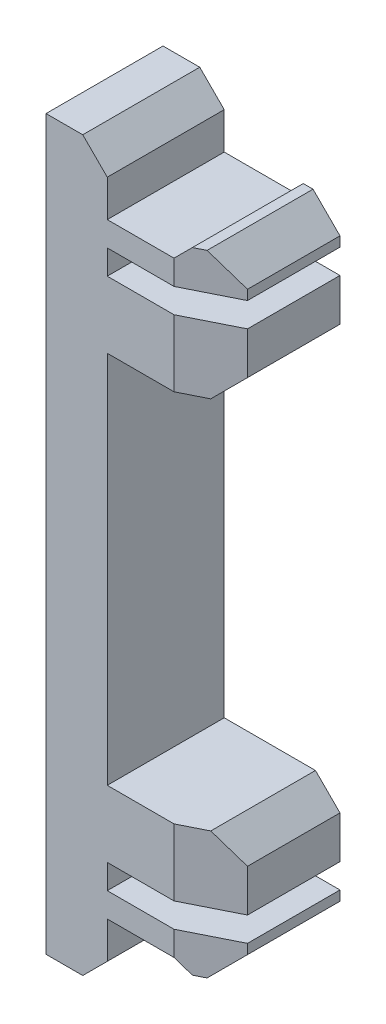
ISO-10303-21;
HEADER;
FILE_DESCRIPTION(('STEP AP214'),'2;1');
FILE_NAME('part.step','',(''),(''),'','','');
FILE_SCHEMA(('AUTOMOTIVE_DESIGN { 1 0 10303 214 1 1 1 1 }'));
ENDSEC;
DATA;
#1=APPLICATION_CONTEXT('core data for automotive mechanical design processes');
#2=APPLICATION_PROTOCOL_DEFINITION('international standard','automotive_design',2000,#1);
#3=PRODUCT_CONTEXT('',#1,'mechanical');
#4=PRODUCT('Part','Part','',(#3));
#5=PRODUCT_RELATED_PRODUCT_CATEGORY('part','',(#4));
#6=PRODUCT_DEFINITION_FORMATION('','',#4);
#7=PRODUCT_DEFINITION_CONTEXT('part definition',#1,'design');
#8=PRODUCT_DEFINITION('design','',#6,#7);
#9=PRODUCT_DEFINITION_SHAPE('','',#8);
#10=(LENGTH_UNIT() NAMED_UNIT(*) SI_UNIT(.MILLI.,.METRE.));
#11=(NAMED_UNIT(*) PLANE_ANGLE_UNIT() SI_UNIT($,.RADIAN.));
#12=(NAMED_UNIT(*) SI_UNIT($,.STERADIAN.) SOLID_ANGLE_UNIT());
#13=UNCERTAINTY_MEASURE_WITH_UNIT(LENGTH_MEASURE(1.E-05),#10,'distance_accuracy_value','');
#14=(GEOMETRIC_REPRESENTATION_CONTEXT(3) GLOBAL_UNCERTAINTY_ASSIGNED_CONTEXT((#13)) GLOBAL_UNIT_ASSIGNED_CONTEXT((#10,
#11,#12)) REPRESENTATION_CONTEXT('',''));
#15=CARTESIAN_POINT('',(0.,0.,0.));
#16=DIRECTION('',(0.,0.,1.));
#17=DIRECTION('',(1.,0.,0.));
#18=AXIS2_PLACEMENT_3D('',#15,#16,#17);
#19=CARTESIAN_POINT('',(-1.412499969,-17.605,3.032500031));
#20=DIRECTION('',(-1.,0.,0.));
#21=DIRECTION('',(0.,0.,1.));
#22=AXIS2_PLACEMENT_3D('',#19,#20,#21);
#23=PLANE('',#22);
#24=DIRECTION('',(0.,0.,-1.));
#25=VECTOR('',#24,1.);
#26=CARTESIAN_POINT('',(-1.412499969,-9.7,9.95865331085167));
#27=LINE('',#26,#25);
#28=CARTESIAN_POINT('',(-1.412499969,-9.7,3.032500031));
#29=VERTEX_POINT('',#28);
#30=CARTESIAN_POINT('',(-1.412499969,-9.7,-3.032500031));
#31=VERTEX_POINT('',#30);
#32=EDGE_CURVE('E288',#29,#31,#27,.T.);
#33=ORIENTED_EDGE('',*,*,#32,.T.);
#34=DIRECTION('',(0.,1.,0.));
#35=VECTOR('',#34,1.);
#36=CARTESIAN_POINT('',(-1.412499969,-17.605,-3.032500031));
#37=LINE('',#36,#35);
#38=CARTESIAN_POINT('',(-1.412499969,9.7,-3.032500031));
#39=VERTEX_POINT('',#38);
#40=EDGE_CURVE('E481',#31,#39,#37,.T.);
#41=ORIENTED_EDGE('',*,*,#40,.T.);
#42=DIRECTION('',(0.,0.,-1.));
#43=VECTOR('',#42,1.);
#44=CARTESIAN_POINT('',(-1.412499969,9.7,9.95865331085167));
#45=LINE('',#44,#43);
#46=CARTESIAN_POINT('',(-1.412499969,9.7,3.032500031));
#47=VERTEX_POINT('',#46);
#48=EDGE_CURVE('E413',#47,#39,#45,.T.);
#49=ORIENTED_EDGE('',*,*,#48,.F.);
#50=DIRECTION('',(0.,1.,0.));
#51=VECTOR('',#50,1.);
#52=CARTESIAN_POINT('',(-1.412499969,-17.605,3.032500031));
#53=LINE('',#52,#51);
#54=EDGE_CURVE('E65',#29,#47,#53,.T.);
#55=ORIENTED_EDGE('',*,*,#54,.F.);
#56=EDGE_LOOP('',(#33,#41,#49,#55));
#57=FACE_BOUND('',#56,.T.);
#58=ADVANCED_FACE('F49',(#57),#23,.F.);
#59=DIRECTION('',(0.,0.,-1.));
#60=VECTOR('',#59,1.);
#61=CARTESIAN_POINT('',(-1.412499969,-13.16,9.95865331085167));
#62=LINE('',#61,#60);
#63=CARTESIAN_POINT('',(-1.412499969,-13.16,3.032500031));
#64=VERTEX_POINT('',#63);
#65=CARTESIAN_POINT('',(-1.412499969,-13.16,-3.032500031));
#66=VERTEX_POINT('',#65);
#67=EDGE_CURVE('E73',#64,#66,#62,.T.);
#68=ORIENTED_EDGE('',*,*,#67,.F.);
#69=CARTESIAN_POINT('',(-1.412499969,-14.43,3.032500031));
#70=VERTEX_POINT('',#69);
#71=EDGE_CURVE('E454',#70,#64,#53,.T.);
#72=ORIENTED_EDGE('',*,*,#71,.F.);
#73=DIRECTION('',(0.,0.,-1.));
#74=VECTOR('',#73,1.);
#75=CARTESIAN_POINT('',(-1.412499969,-14.43,9.95865331085167));
#76=LINE('',#75,#74);
#77=CARTESIAN_POINT('',(-1.412499969,-14.43,-3.032500031));
#78=VERTEX_POINT('',#77);
#79=EDGE_CURVE('E961',#70,#78,#76,.T.);
#80=ORIENTED_EDGE('',*,*,#79,.T.);
#81=EDGE_CURVE('E480',#78,#66,#37,.T.);
#82=ORIENTED_EDGE('',*,*,#81,.T.);
#83=EDGE_LOOP('',(#68,#72,#80,#82));
#84=FACE_BOUND('',#83,.T.);
#85=ADVANCED_FACE('F630',(#84),#23,.F.);
#86=DIRECTION('',(0.,0.,-1.));
#87=VECTOR('',#86,1.);
#88=CARTESIAN_POINT('',(-1.412499969,14.43,9.95865331085167));
#89=LINE('',#88,#87);
#90=CARTESIAN_POINT('',(-1.412499969,14.43,3.032500031));
#91=VERTEX_POINT('',#90);
#92=CARTESIAN_POINT('',(-1.412499969,14.43,-3.032500031));
#93=VERTEX_POINT('',#92);
#94=EDGE_CURVE('E353',#91,#93,#89,.T.);
#95=ORIENTED_EDGE('',*,*,#94,.F.);
#96=CARTESIAN_POINT('',(-1.412499969,13.16,3.032500031));
#97=VERTEX_POINT('',#96);
#98=EDGE_CURVE('E455',#97,#91,#53,.T.);
#99=ORIENTED_EDGE('',*,*,#98,.F.);
#100=DIRECTION('',(0.,0.,-1.));
#101=VECTOR('',#100,1.);
#102=CARTESIAN_POINT('',(-1.412499969,13.16,9.95865331085167));
#103=LINE('',#102,#101);
#104=CARTESIAN_POINT('',(-1.412499969,13.16,-3.032500031));
#105=VERTEX_POINT('',#104);
#106=EDGE_CURVE('E432',#97,#105,#103,.T.);
#107=ORIENTED_EDGE('',*,*,#106,.T.);
#108=EDGE_CURVE('E482',#105,#93,#37,.T.);
#109=ORIENTED_EDGE('',*,*,#108,.T.);
#110=EDGE_LOOP('',(#95,#99,#107,#109));
#111=FACE_BOUND('',#110,.T.);
#112=ADVANCED_FACE('F605',(#111),#23,.F.);
#113=CARTESIAN_POINT('',(-1.412499969,-17.605,-3.032500031));
#114=VERTEX_POINT('',#113);
#115=CARTESIAN_POINT('',(-1.412499969,-15.7,-3.032500031));
#116=VERTEX_POINT('',#115);
#117=EDGE_CURVE('E475',#114,#116,#37,.T.);
#118=ORIENTED_EDGE('',*,*,#117,.T.);
#119=DIRECTION('',(0.,0.,-1.));
#120=VECTOR('',#119,1.);
#121=CARTESIAN_POINT('',(-1.412499969,-15.7,9.95865331085167));
#122=LINE('',#121,#120);
#123=CARTESIAN_POINT('',(-1.412499969,-15.7,3.032500031));
#124=VERTEX_POINT('',#123);
#125=EDGE_CURVE('E985',#124,#116,#122,.T.);
#126=ORIENTED_EDGE('',*,*,#125,.F.);
#127=CARTESIAN_POINT('',(-1.412499969,-17.605,3.032500031));
#128=VERTEX_POINT('',#127);
#129=EDGE_CURVE('E449',#128,#124,#53,.T.);
#130=ORIENTED_EDGE('',*,*,#129,.F.);
#131=DIRECTION('',(0.,0.,-1.));
#132=VECTOR('',#131,1.);
#133=CARTESIAN_POINT('',(-1.412499969,-17.605,3.032500031));
#134=LINE('',#133,#132);
#135=EDGE_CURVE('E58',#128,#114,#134,.T.);
#136=ORIENTED_EDGE('',*,*,#135,.T.);
#137=EDGE_LOOP('',(#118,#126,#130,#136));
#138=FACE_BOUND('',#137,.T.);
#139=ADVANCED_FACE('F515',(#138),#23,.F.);
#140=CARTESIAN_POINT('',(-2.682499969,-18.875,3.032500031));
#141=DIRECTION('',(-0.707106781186544,0.707106781186551,0.));
#142=DIRECTION('',(-0.707106781186551,-0.707106781186544,0.));
#143=AXIS2_PLACEMENT_3D('',#140,#141,#142);
#144=PLANE('',#143);
#145=DIRECTION('',(0.707106781186551,0.707106781186544,0.));
#146=VECTOR('',#145,1.);
#147=CARTESIAN_POINT('',(-2.682499969,-18.875,-3.032500031));
#148=LINE('',#147,#146);
#149=CARTESIAN_POINT('',(-2.682499969,-18.875,-3.032500031));
#150=VERTEX_POINT('',#149);
#151=EDGE_CURVE('E384',#150,#114,#148,.T.);
#152=ORIENTED_EDGE('',*,*,#151,.T.);
#153=ORIENTED_EDGE('',*,*,#135,.F.);
#154=DIRECTION('',(0.707106781186551,0.707106781186544,0.));
#155=VECTOR('',#154,1.);
#156=CARTESIAN_POINT('',(-2.682499969,-18.875,3.032500031));
#157=LINE('',#156,#155);
#158=CARTESIAN_POINT('',(-2.682499969,-18.875,3.032500031));
#159=VERTEX_POINT('',#158);
#160=EDGE_CURVE('E443',#159,#128,#157,.T.);
#161=ORIENTED_EDGE('',*,*,#160,.F.);
#162=DIRECTION('',(0.,0.,-1.));
#163=VECTOR('',#162,1.);
#164=CARTESIAN_POINT('',(-2.682499969,-18.875,3.032500031));
#165=LINE('',#164,#163);
#166=EDGE_CURVE('E470',#159,#150,#165,.T.);
#167=ORIENTED_EDGE('',*,*,#166,.T.);
#168=EDGE_LOOP('',(#152,#153,#161,#167));
#169=FACE_BOUND('',#168,.T.);
#170=ADVANCED_FACE('F51',(#169),#144,.F.);
#171=CARTESIAN_POINT('',(-1.412499969,15.7,3.032500031));
#172=VERTEX_POINT('',#171);
#173=CARTESIAN_POINT('',(-1.412499969,17.605,3.032500031));
#174=VERTEX_POINT('',#173);
#175=EDGE_CURVE('E447',#172,#174,#53,.T.);
#176=ORIENTED_EDGE('',*,*,#175,.F.);
#177=DIRECTION('',(0.,0.,-1.));
#178=VECTOR('',#177,1.);
#179=CARTESIAN_POINT('',(-1.412499969,15.7,9.95865331085167));
#180=LINE('',#179,#178);
#181=CARTESIAN_POINT('',(-1.412499969,15.7,-3.032500031));
#182=VERTEX_POINT('',#181);
#183=EDGE_CURVE('E388',#172,#182,#180,.T.);
#184=ORIENTED_EDGE('',*,*,#183,.T.);
#185=CARTESIAN_POINT('',(-1.412499969,17.605,-3.032500031));
#186=VERTEX_POINT('',#185);
#187=EDGE_CURVE('E474',#182,#186,#37,.T.);
#188=ORIENTED_EDGE('',*,*,#187,.T.);
#189=DIRECTION('',(0.,0.,-1.));
#190=VECTOR('',#189,1.);
#191=CARTESIAN_POINT('',(-1.412499969,17.605,3.032500031));
#192=LINE('',#191,#190);
#193=EDGE_CURVE('E508',#174,#186,#192,.T.);
#194=ORIENTED_EDGE('',*,*,#193,.F.);
#195=EDGE_LOOP('',(#176,#184,#188,#194));
#196=FACE_BOUND('',#195,.T.);
#197=ADVANCED_FACE('F542',(#196),#23,.F.);
#198=CARTESIAN_POINT('',(-2.682499969,18.875,3.032500031));
#199=DIRECTION('',(0.707106781186544,0.707106781186551,0.));
#200=DIRECTION('',(-0.707106781186551,0.707106781186544,0.));
#201=AXIS2_PLACEMENT_3D('',#198,#199,#200);
#202=PLANE('',#201);
#203=DIRECTION('',(0.707106781186551,-0.707106781186544,0.));
#204=VECTOR('',#203,1.);
#205=CARTESIAN_POINT('',(-2.682499969,18.875,-3.032500031));
#206=LINE('',#205,#204);
#207=CARTESIAN_POINT('',(-2.682499969,18.875,-3.032500031));
#208=VERTEX_POINT('',#207);
#209=EDGE_CURVE('E479',#208,#186,#206,.T.);
#210=ORIENTED_EDGE('',*,*,#209,.F.);
#211=DIRECTION('',(0.,0.,-1.));
#212=VECTOR('',#211,1.);
#213=CARTESIAN_POINT('',(-2.682499969,18.875,3.032500031));
#214=LINE('',#213,#212);
#215=CARTESIAN_POINT('',(-2.682499969,18.875,3.032500031));
#216=VERTEX_POINT('',#215);
#217=EDGE_CURVE('E505',#216,#208,#214,.T.);
#218=ORIENTED_EDGE('',*,*,#217,.F.);
#219=DIRECTION('',(0.707106781186551,-0.707106781186544,0.));
#220=VECTOR('',#219,1.);
#221=CARTESIAN_POINT('',(-2.682499969,18.875,3.032500031));
#222=LINE('',#221,#220);
#223=EDGE_CURVE('E453',#216,#174,#222,.T.);
#224=ORIENTED_EDGE('',*,*,#223,.T.);
#225=ORIENTED_EDGE('',*,*,#193,.T.);
#226=EDGE_LOOP('',(#210,#218,#224,#225));
#227=FACE_BOUND('',#226,.T.);
#228=ADVANCED_FACE('F537',(#227),#202,.T.);
#229=CARTESIAN_POINT('',(-2.682499969,18.875,3.032500031));
#230=DIRECTION('',(0.,-1.,0.));
#231=DIRECTION('',(0.,0.,-1.));
#232=AXIS2_PLACEMENT_3D('',#229,#230,#231);
#233=PLANE('',#232);
#234=DIRECTION('',(-1.,0.,0.));
#235=VECTOR('',#234,1.);
#236=CARTESIAN_POINT('',(-2.682499969,18.875,-3.032500031));
#237=LINE('',#236,#235);
#238=CARTESIAN_POINT('',(-4.587499969,18.875,-3.032500031));
#239=VERTEX_POINT('',#238);
#240=EDGE_CURVE('E486',#208,#239,#237,.T.);
#241=ORIENTED_EDGE('',*,*,#240,.T.);
#242=DIRECTION('',(0.,0.,-1.));
#243=VECTOR('',#242,1.);
#244=CARTESIAN_POINT('',(-4.587499969,18.875,3.032500031));
#245=LINE('',#244,#243);
#246=CARTESIAN_POINT('',(-4.587499969,18.875,3.032500031));
#247=VERTEX_POINT('',#246);
#248=EDGE_CURVE('E502',#247,#239,#245,.T.);
#249=ORIENTED_EDGE('',*,*,#248,.F.);
#250=DIRECTION('',(-1.,0.,0.));
#251=VECTOR('',#250,1.);
#252=CARTESIAN_POINT('',(-2.682499969,18.875,3.032500031));
#253=LINE('',#252,#251);
#254=EDGE_CURVE('E459',#216,#247,#253,.T.);
#255=ORIENTED_EDGE('',*,*,#254,.F.);
#256=ORIENTED_EDGE('',*,*,#217,.T.);
#257=EDGE_LOOP('',(#241,#249,#255,#256));
#258=FACE_BOUND('',#257,.T.);
#259=ADVANCED_FACE('F638',(#258),#233,.F.);
#260=CARTESIAN_POINT('',(-4.587499969,-18.875,3.032500031));
#261=DIRECTION('',(-1.,0.,0.));
#262=DIRECTION('',(0.,0.,1.));
#263=AXIS2_PLACEMENT_3D('',#260,#261,#262);
#264=PLANE('',#263);
#265=DIRECTION('',(0.,1.,0.));
#266=VECTOR('',#265,1.);
#267=CARTESIAN_POINT('',(-4.587499969,-18.875,-3.032500031));
#268=LINE('',#267,#266);
#269=CARTESIAN_POINT('',(-4.587499969,-18.875,-3.032500031));
#270=VERTEX_POINT('',#269);
#271=EDGE_CURVE('E490',#270,#239,#268,.T.);
#272=ORIENTED_EDGE('',*,*,#271,.F.);
#273=DIRECTION('',(0.,0.,-1.));
#274=VECTOR('',#273,1.);
#275=CARTESIAN_POINT('',(-4.587499969,-18.875,3.032500031));
#276=LINE('',#275,#274);
#277=CARTESIAN_POINT('',(-4.587499969,-18.875,3.032500031));
#278=VERTEX_POINT('',#277);
#279=EDGE_CURVE('E499',#278,#270,#276,.T.);
#280=ORIENTED_EDGE('',*,*,#279,.F.);
#281=DIRECTION('',(0.,1.,0.));
#282=VECTOR('',#281,1.);
#283=CARTESIAN_POINT('',(-4.587499969,-18.875,3.032500031));
#284=LINE('',#283,#282);
#285=EDGE_CURVE('E462',#278,#247,#284,.T.);
#286=ORIENTED_EDGE('',*,*,#285,.T.);
#287=ORIENTED_EDGE('',*,*,#248,.T.);
#288=EDGE_LOOP('',(#272,#280,#286,#287));
#289=FACE_BOUND('',#288,.T.);
#290=ADVANCED_FACE('F530',(#289),#264,.T.);
#291=CARTESIAN_POINT('',(-2.682499969,-18.875,3.032500031));
#292=DIRECTION('',(0.,-1.,0.));
#293=DIRECTION('',(0.,0.,-1.));
#294=AXIS2_PLACEMENT_3D('',#291,#292,#293);
#295=PLANE('',#294);
#296=DIRECTION('',(-1.,0.,0.));
#297=VECTOR('',#296,1.);
#298=CARTESIAN_POINT('',(-2.682499969,-18.875,-3.032500031));
#299=LINE('',#298,#297);
#300=EDGE_CURVE('E448',#150,#270,#299,.T.);
#301=ORIENTED_EDGE('',*,*,#300,.F.);
#302=ORIENTED_EDGE('',*,*,#166,.F.);
#303=DIRECTION('',(-1.,0.,0.));
#304=VECTOR('',#303,1.);
#305=CARTESIAN_POINT('',(-2.682499969,-18.875,3.032500031));
#306=LINE('',#305,#304);
#307=EDGE_CURVE('E466',#159,#278,#306,.T.);
#308=ORIENTED_EDGE('',*,*,#307,.T.);
#309=ORIENTED_EDGE('',*,*,#279,.T.);
#310=EDGE_LOOP('',(#301,#302,#308,#309));
#311=FACE_BOUND('',#310,.T.);
#312=ADVANCED_FACE('F525',(#311),#295,.T.);
#313=CARTESIAN_POINT('',(0.,0.,3.032500031));
#314=DIRECTION('',(0.,0.,-1.));
#315=DIRECTION('',(-1.,0.,0.));
#316=AXIS2_PLACEMENT_3D('',#313,#314,#315);
#317=PLANE('',#316);
#318=ORIENTED_EDGE('',*,*,#54,.T.);
#319=DIRECTION('',(-1.,0.,0.));
#320=VECTOR('',#319,1.);
#321=CARTESIAN_POINT('',(0.,9.7,3.032500031));
#322=LINE('',#321,#320);
#323=CARTESIAN_POINT('',(2.047499969,9.7,3.032500031));
#324=VERTEX_POINT('',#323);
#325=EDGE_CURVE('E374',#324,#47,#322,.T.);
#326=ORIENTED_EDGE('',*,*,#325,.F.);
#327=DIRECTION('',(0.,-1.,0.));
#328=VECTOR('',#327,1.);
#329=CARTESIAN_POINT('',(2.047499969,18.875,3.032500031));
#330=LINE('',#329,#328);
#331=CARTESIAN_POINT('',(2.047499969,13.16,3.032500031));
#332=VERTEX_POINT('',#331);
#333=EDGE_CURVE('E322',#332,#324,#330,.T.);
#334=ORIENTED_EDGE('',*,*,#333,.F.);
#335=DIRECTION('',(1.,0.,0.));
#336=VECTOR('',#335,1.);
#337=CARTESIAN_POINT('',(0.,13.16,3.032500031));
#338=LINE('',#337,#336);
#339=EDGE_CURVE('E421',#97,#332,#338,.T.);
#340=ORIENTED_EDGE('',*,*,#339,.F.);
#341=ORIENTED_EDGE('',*,*,#98,.T.);
#342=DIRECTION('',(1.,0.,0.));
#343=VECTOR('',#342,1.);
#344=CARTESIAN_POINT('',(0.,14.43,3.032500031));
#345=LINE('',#344,#343);
#346=CARTESIAN_POINT('',(2.047499969,14.43,3.032500031));
#347=VERTEX_POINT('',#346);
#348=EDGE_CURVE('E379',#91,#347,#345,.T.);
#349=ORIENTED_EDGE('',*,*,#348,.T.);
#350=CARTESIAN_POINT('',(2.047499969,15.7,3.032500031));
#351=VERTEX_POINT('',#350);
#352=EDGE_CURVE('E328',#351,#347,#330,.T.);
#353=ORIENTED_EDGE('',*,*,#352,.F.);
#354=DIRECTION('',(-1.,0.,0.));
#355=VECTOR('',#354,1.);
#356=CARTESIAN_POINT('',(0.,15.7,3.032500031));
#357=LINE('',#356,#355);
#358=EDGE_CURVE('E375',#351,#172,#357,.T.);
#359=ORIENTED_EDGE('',*,*,#358,.T.);
#360=ORIENTED_EDGE('',*,*,#175,.T.);
#361=ORIENTED_EDGE('',*,*,#223,.F.);
#362=ORIENTED_EDGE('',*,*,#254,.T.);
#363=ORIENTED_EDGE('',*,*,#285,.F.);
#364=ORIENTED_EDGE('',*,*,#307,.F.);
#365=ORIENTED_EDGE('',*,*,#160,.T.);
#366=ORIENTED_EDGE('',*,*,#129,.T.);
#367=DIRECTION('',(-1.,0.,0.));
#368=VECTOR('',#367,1.);
#369=CARTESIAN_POINT('',(0.,-15.7,3.032500031));
#370=LINE('',#369,#368);
#371=CARTESIAN_POINT('',(2.047499969,-15.7,3.032500031));
#372=VERTEX_POINT('',#371);
#373=EDGE_CURVE('E976',#372,#124,#370,.T.);
#374=ORIENTED_EDGE('',*,*,#373,.F.);
#375=DIRECTION('',(0.,1.,0.));
#376=VECTOR('',#375,1.);
#377=CARTESIAN_POINT('',(2.047499969,-18.875,3.032500031));
#378=LINE('',#377,#376);
#379=CARTESIAN_POINT('',(2.047499969,-14.43,3.032500031));
#380=VERTEX_POINT('',#379);
#381=EDGE_CURVE('E284',#372,#380,#378,.T.);
#382=ORIENTED_EDGE('',*,*,#381,.T.);
#383=DIRECTION('',(1.,0.,0.));
#384=VECTOR('',#383,1.);
#385=CARTESIAN_POINT('',(0.,-14.43,3.032500031));
#386=LINE('',#385,#384);
#387=EDGE_CURVE('E319',#70,#380,#386,.T.);
#388=ORIENTED_EDGE('',*,*,#387,.F.);
#389=ORIENTED_EDGE('',*,*,#71,.T.);
#390=DIRECTION('',(1.,0.,0.));
#391=VECTOR('',#390,1.);
#392=CARTESIAN_POINT('',(0.,-13.16,3.032500031));
#393=LINE('',#392,#391);
#394=CARTESIAN_POINT('',(2.047499969,-13.16,3.032500031));
#395=VERTEX_POINT('',#394);
#396=EDGE_CURVE('E282',#64,#395,#393,.T.);
#397=ORIENTED_EDGE('',*,*,#396,.T.);
#398=CARTESIAN_POINT('',(2.047499969,-9.7,3.032500031));
#399=VERTEX_POINT('',#398);
#400=EDGE_CURVE('E268',#395,#399,#378,.T.);
#401=ORIENTED_EDGE('',*,*,#400,.T.);
#402=DIRECTION('',(-1.,0.,0.));
#403=VECTOR('',#402,1.);
#404=CARTESIAN_POINT('',(0.,-9.7,3.032500031));
#405=LINE('',#404,#403);
#406=EDGE_CURVE('E279',#399,#29,#405,.T.);
#407=ORIENTED_EDGE('',*,*,#406,.T.);
#408=EDGE_LOOP('',(#318,#326,#334,#340,#341,#349,#353,#359,#360,#361,#362,#363,#364,#365,#366,
#374,#382,#388,#389,#397,#401,#407));
#409=FACE_BOUND('',#408,.T.);
#410=ADVANCED_FACE('F278',(#409),#317,.F.);
#411=CARTESIAN_POINT('',(0.,0.,-3.032500031));
#412=DIRECTION('',(0.,0.,-1.));
#413=DIRECTION('',(-1.,0.,0.));
#414=AXIS2_PLACEMENT_3D('',#411,#412,#413);
#415=PLANE('',#414);
#416=ORIENTED_EDGE('',*,*,#108,.F.);
#417=DIRECTION('',(-1.,0.,0.));
#418=VECTOR('',#417,1.);
#419=CARTESIAN_POINT('',(0.,13.16,-3.032500031));
#420=LINE('',#419,#418);
#421=CARTESIAN_POINT('',(4.587499969,13.16,-3.032500031));
#422=VERTEX_POINT('',#421);
#423=EDGE_CURVE('E414',#422,#105,#420,.T.);
#424=ORIENTED_EDGE('',*,*,#423,.F.);
#425=DIRECTION('',(0.,1.,0.));
#426=VECTOR('',#425,1.);
#427=CARTESIAN_POINT('',(4.587499969,0.,-3.032500031));
#428=LINE('',#427,#426);
#429=CARTESIAN_POINT('',(4.587499969,10.97,-3.032500031));
#430=VERTEX_POINT('',#429);
#431=EDGE_CURVE('E408',#430,#422,#428,.T.);
#432=ORIENTED_EDGE('',*,*,#431,.F.);
#433=DIRECTION('',(0.707106781186548,0.707106781186548,0.));
#434=VECTOR('',#433,1.);
#435=CARTESIAN_POINT('',(-3.1912500155,3.1912500155,-3.032500031));
#436=LINE('',#435,#434);
#437=CARTESIAN_POINT('',(3.317499969,9.7,-3.032500031));
#438=VERTEX_POINT('',#437);
#439=EDGE_CURVE('E348',#438,#430,#436,.T.);
#440=ORIENTED_EDGE('',*,*,#439,.F.);
#441=DIRECTION('',(1.,0.,0.));
#442=VECTOR('',#441,1.);
#443=CARTESIAN_POINT('',(0.,9.7,-3.032500031));
#444=LINE('',#443,#442);
#445=EDGE_CURVE('E409',#39,#438,#444,.T.);
#446=ORIENTED_EDGE('',*,*,#445,.F.);
#447=ORIENTED_EDGE('',*,*,#40,.F.);
#448=DIRECTION('',(1.,0.,0.));
#449=VECTOR('',#448,1.);
#450=CARTESIAN_POINT('',(0.,-9.7,-3.032500031));
#451=LINE('',#450,#449);
#452=CARTESIAN_POINT('',(3.317499969,-9.7,-3.032500031));
#453=VERTEX_POINT('',#452);
#454=EDGE_CURVE('E303',#31,#453,#451,.T.);
#455=ORIENTED_EDGE('',*,*,#454,.T.);
#456=DIRECTION('',(0.707106781186548,-0.707106781186548,0.));
#457=VECTOR('',#456,1.);
#458=CARTESIAN_POINT('',(-3.1912500155,-3.1912500155,-3.032500031));
#459=LINE('',#458,#457);
#460=CARTESIAN_POINT('',(4.587499969,-10.97,-3.032500031));
#461=VERTEX_POINT('',#460);
#462=EDGE_CURVE('E950',#453,#461,#459,.T.);
#463=ORIENTED_EDGE('',*,*,#462,.T.);
#464=DIRECTION('',(0.,-1.,0.));
#465=VECTOR('',#464,1.);
#466=CARTESIAN_POINT('',(4.587499969,0.,-3.032500031));
#467=LINE('',#466,#465);
#468=CARTESIAN_POINT('',(4.587499969,-13.16,-3.032500031));
#469=VERTEX_POINT('',#468);
#470=EDGE_CURVE('E1006',#461,#469,#467,.T.);
#471=ORIENTED_EDGE('',*,*,#470,.T.);
#472=DIRECTION('',(-1.,0.,0.));
#473=VECTOR('',#472,1.);
#474=CARTESIAN_POINT('',(0.,-13.16,-3.032500031));
#475=LINE('',#474,#473);
#476=EDGE_CURVE('E1009',#469,#66,#475,.T.);
#477=ORIENTED_EDGE('',*,*,#476,.T.);
#478=ORIENTED_EDGE('',*,*,#81,.F.);
#479=DIRECTION('',(-1.,0.,0.));
#480=VECTOR('',#479,1.);
#481=CARTESIAN_POINT('',(0.,-14.43,-3.032500031));
#482=LINE('',#481,#480);
#483=CARTESIAN_POINT('',(4.587499969,-14.43,-3.032500031));
#484=VERTEX_POINT('',#483);
#485=EDGE_CURVE('E295',#484,#78,#482,.T.);
#486=ORIENTED_EDGE('',*,*,#485,.F.);
#487=DIRECTION('',(0.,1.,0.));
#488=VECTOR('',#487,1.);
#489=CARTESIAN_POINT('',(4.587499969,0.,-3.032500031));
#490=LINE('',#489,#488);
#491=CARTESIAN_POINT('',(4.587499969,-14.938,-3.032500031));
#492=VERTEX_POINT('',#491);
#493=EDGE_CURVE('E290',#492,#484,#490,.T.);
#494=ORIENTED_EDGE('',*,*,#493,.F.);
#495=DIRECTION('',(0.707106781186549,0.707106781186546,0.));
#496=VECTOR('',#495,1.);
#497=CARTESIAN_POINT('',(9.76274998449999,-9.76274998450002,-3.032500031));
#498=LINE('',#497,#496);
#499=CARTESIAN_POINT('',(3.19049996899999,-16.335,-3.032500031));
#500=VERTEX_POINT('',#499);
#501=EDGE_CURVE('E957',#500,#492,#498,.T.);
#502=ORIENTED_EDGE('',*,*,#501,.F.);
#503=DIRECTION('',(1.,0.,0.));
#504=VECTOR('',#503,1.);
#505=CARTESIAN_POINT('',(0.,-16.335,-3.032500031));
#506=LINE('',#505,#504);
#507=CARTESIAN_POINT('',(2.68249996899999,-16.335,-3.032500031));
#508=VERTEX_POINT('',#507);
#509=EDGE_CURVE('E962',#508,#500,#506,.T.);
#510=ORIENTED_EDGE('',*,*,#509,.F.);
#511=DIRECTION('',(0.707106781186547,-0.707106781186548,0.));
#512=VECTOR('',#511,1.);
#513=CARTESIAN_POINT('',(-6.8262500155,-6.82625001549999,-3.032500031));
#514=LINE('',#513,#512);
#515=CARTESIAN_POINT('',(2.04749996899999,-15.7,-3.032500031));
#516=VERTEX_POINT('',#515);
#517=EDGE_CURVE('E966',#516,#508,#514,.T.);
#518=ORIENTED_EDGE('',*,*,#517,.F.);
#519=DIRECTION('',(1.,0.,0.));
#520=VECTOR('',#519,1.);
#521=CARTESIAN_POINT('',(0.,-15.7,-3.032500031));
#522=LINE('',#521,#520);
#523=EDGE_CURVE('E970',#116,#516,#522,.T.);
#524=ORIENTED_EDGE('',*,*,#523,.F.);
#525=ORIENTED_EDGE('',*,*,#117,.F.);
#526=ORIENTED_EDGE('',*,*,#151,.F.);
#527=ORIENTED_EDGE('',*,*,#300,.T.);
#528=ORIENTED_EDGE('',*,*,#271,.T.);
#529=ORIENTED_EDGE('',*,*,#240,.F.);
#530=ORIENTED_EDGE('',*,*,#209,.T.);
#531=ORIENTED_EDGE('',*,*,#187,.F.);
#532=DIRECTION('',(1.,0.,0.));
#533=VECTOR('',#532,1.);
#534=CARTESIAN_POINT('',(0.,15.7,-3.032500031));
#535=LINE('',#534,#533);
#536=CARTESIAN_POINT('',(2.04749996899999,15.7,-3.032500031));
#537=VERTEX_POINT('',#536);
#538=EDGE_CURVE('E362',#182,#537,#535,.T.);
#539=ORIENTED_EDGE('',*,*,#538,.T.);
#540=DIRECTION('',(0.707106781186547,0.707106781186548,0.));
#541=VECTOR('',#540,1.);
#542=CARTESIAN_POINT('',(-6.8262500155,6.82625001549999,-3.032500031));
#543=LINE('',#542,#541);
#544=CARTESIAN_POINT('',(2.68249996899999,16.335,-3.032500031));
#545=VERTEX_POINT('',#544);
#546=EDGE_CURVE('E358',#537,#545,#543,.T.);
#547=ORIENTED_EDGE('',*,*,#546,.T.);
#548=DIRECTION('',(1.,0.,0.));
#549=VECTOR('',#548,1.);
#550=CARTESIAN_POINT('',(0.,16.335,-3.032500031));
#551=LINE('',#550,#549);
#552=CARTESIAN_POINT('',(3.19049996899999,16.335,-3.032500031));
#553=VERTEX_POINT('',#552);
#554=EDGE_CURVE('E354',#545,#553,#551,.T.);
#555=ORIENTED_EDGE('',*,*,#554,.T.);
#556=DIRECTION('',(0.707106781186549,-0.707106781186546,0.));
#557=VECTOR('',#556,1.);
#558=CARTESIAN_POINT('',(9.76274998449999,9.76274998450002,-3.032500031));
#559=LINE('',#558,#557);
#560=CARTESIAN_POINT('',(4.587499969,14.938,-3.032500031));
#561=VERTEX_POINT('',#560);
#562=EDGE_CURVE('E349',#553,#561,#559,.T.);
#563=ORIENTED_EDGE('',*,*,#562,.T.);
#564=DIRECTION('',(0.,-1.,0.));
#565=VECTOR('',#564,1.);
#566=CARTESIAN_POINT('',(4.587499969,0.,-3.032500031));
#567=LINE('',#566,#565);
#568=CARTESIAN_POINT('',(4.587499969,14.43,-3.032500031));
#569=VERTEX_POINT('',#568);
#570=EDGE_CURVE('E370',#561,#569,#567,.T.);
#571=ORIENTED_EDGE('',*,*,#570,.T.);
#572=DIRECTION('',(-1.,0.,0.));
#573=VECTOR('',#572,1.);
#574=CARTESIAN_POINT('',(0.,14.43,-3.032500031));
#575=LINE('',#574,#573);
#576=EDGE_CURVE('E366',#569,#93,#575,.T.);
#577=ORIENTED_EDGE('',*,*,#576,.T.);
#578=EDGE_LOOP('',(#416,#424,#432,#440,#446,#447,#455,#463,#471,#477,#478,#486,#494,#502,#510,
#518,#524,#525,#526,#527,#528,#529,#530,#531,#539,#547,#555,#563,#571,#577));
#579=FACE_BOUND('',#578,.T.);
#580=ADVANCED_FACE('F523',(#579),#415,.T.);
#581=CARTESIAN_POINT('',(0.,9.7,9.95865331085167));
#582=DIRECTION('',(0.,1.,0.));
#583=DIRECTION('',(0.,0.,1.));
#584=AXIS2_PLACEMENT_3D('',#581,#582,#583);
#585=PLANE('',#584);
#586=DIRECTION('',(0.,0.,-1.));
#587=VECTOR('',#586,1.);
#588=CARTESIAN_POINT('',(3.317499969,9.7,9.95865331085167));
#589=LINE('',#588,#587);
#590=CARTESIAN_POINT('',(3.317499969,9.7,2.397500031));
#591=VERTEX_POINT('',#590);
#592=EDGE_CURVE('E425',#591,#438,#589,.T.);
#593=ORIENTED_EDGE('',*,*,#592,.F.);
#594=DIRECTION('',(0.894427190999916,0.,-0.447213595499958));
#595=VECTOR('',#594,1.);
#596=CARTESIAN_POINT('',(2.047499969,9.7,3.032500031));
#597=LINE('',#596,#595);
#598=EDGE_CURVE('E318',#324,#591,#597,.T.);
#599=ORIENTED_EDGE('',*,*,#598,.F.);
#600=ORIENTED_EDGE('',*,*,#325,.T.);
#601=ORIENTED_EDGE('',*,*,#48,.T.);
#602=ORIENTED_EDGE('',*,*,#445,.T.);
#603=EDGE_LOOP('',(#593,#599,#600,#601,#602));
#604=FACE_BOUND('',#603,.T.);
#605=ADVANCED_FACE('F557',(#604),#585,.F.);
#606=CARTESIAN_POINT('',(-3.1912500155,3.1912500155,9.95865331085167));
#607=DIRECTION('',(-0.707106781186547,0.707106781186547,0.));
#608=DIRECTION('',(-0.707106781186548,-0.707106781186548,0.));
#609=AXIS2_PLACEMENT_3D('',#606,#607,#608);
#610=PLANE('',#609);
#611=DIRECTION('',(0.,0.,-1.));
#612=VECTOR('',#611,1.);
#613=CARTESIAN_POINT('',(4.587499969,10.97,9.95865331085167));
#614=LINE('',#613,#612);
#615=CARTESIAN_POINT('',(4.587499969,10.97,1.762500031));
#616=VERTEX_POINT('',#615);
#617=EDGE_CURVE('E438',#616,#430,#614,.T.);
#618=ORIENTED_EDGE('',*,*,#617,.F.);
#619=DIRECTION('',(-0.666666666666667,-0.666666666666667,0.333333333333333));
#620=VECTOR('',#619,1.);
#621=CARTESIAN_POINT('',(-4.14831185718926,2.23418817381074,6.13040594409463));
#622=LINE('',#621,#620);
#623=EDGE_CURVE('E344',#616,#591,#622,.T.);
#624=ORIENTED_EDGE('',*,*,#623,.T.);
#625=ORIENTED_EDGE('',*,*,#592,.T.);
#626=ORIENTED_EDGE('',*,*,#439,.T.);
#627=EDGE_LOOP('',(#618,#624,#625,#626));
#628=FACE_BOUND('',#627,.T.);
#629=ADVANCED_FACE('F565',(#628),#610,.F.);
#630=CARTESIAN_POINT('',(4.587499969,0.,9.95865331085167));
#631=DIRECTION('',(-1.,0.,0.));
#632=DIRECTION('',(0.,0.,1.));
#633=AXIS2_PLACEMENT_3D('',#630,#631,#632);
#634=PLANE('',#633);
#635=DIRECTION('',(0.,0.,-1.));
#636=VECTOR('',#635,1.);
#637=CARTESIAN_POINT('',(4.587499969,13.16,9.95865331085167));
#638=LINE('',#637,#636);
#639=CARTESIAN_POINT('',(4.587499969,13.16,1.762500031));
#640=VERTEX_POINT('',#639);
#641=EDGE_CURVE('E435',#640,#422,#638,.T.);
#642=ORIENTED_EDGE('',*,*,#641,.F.);
#643=DIRECTION('',(0.,-1.,0.));
#644=VECTOR('',#643,1.);
#645=CARTESIAN_POINT('',(4.587499969,18.875,1.762500031));
#646=LINE('',#645,#644);
#647=EDGE_CURVE('E323',#640,#616,#646,.T.);
#648=ORIENTED_EDGE('',*,*,#647,.T.);
#649=ORIENTED_EDGE('',*,*,#617,.T.);
#650=ORIENTED_EDGE('',*,*,#431,.T.);
#651=EDGE_LOOP('',(#642,#648,#649,#650));
#652=FACE_BOUND('',#651,.T.);
#653=ADVANCED_FACE('F611',(#652),#634,.F.);
#654=CARTESIAN_POINT('',(0.,13.16,9.95865331085167));
#655=DIRECTION('',(0.,-1.,0.));
#656=DIRECTION('',(0.,0.,-1.));
#657=AXIS2_PLACEMENT_3D('',#654,#655,#656);
#658=PLANE('',#657);
#659=ORIENTED_EDGE('',*,*,#339,.T.);
#660=DIRECTION('',(0.894427190999916,0.,-0.447213595499958));
#661=VECTOR('',#660,1.);
#662=CARTESIAN_POINT('',(-2.36096131814067,13.16,5.23673067457033));
#663=LINE('',#662,#661);
#664=EDGE_CURVE('E340',#332,#640,#663,.T.);
#665=ORIENTED_EDGE('',*,*,#664,.T.);
#666=ORIENTED_EDGE('',*,*,#641,.T.);
#667=ORIENTED_EDGE('',*,*,#423,.T.);
#668=ORIENTED_EDGE('',*,*,#106,.F.);
#669=EDGE_LOOP('',(#659,#665,#666,#667,#668));
#670=FACE_BOUND('',#669,.T.);
#671=ADVANCED_FACE('F608',(#670),#658,.F.);
#672=CARTESIAN_POINT('',(0.,14.43,9.95865331085167));
#673=DIRECTION('',(0.,-1.,0.));
#674=DIRECTION('',(0.,0.,-1.));
#675=AXIS2_PLACEMENT_3D('',#672,#673,#674);
#676=PLANE('',#675);
#677=DIRECTION('',(0.894427190999916,0.,-0.447213595499958));
#678=VECTOR('',#677,1.);
#679=CARTESIAN_POINT('',(-2.36096131814067,14.43,5.23673067457033));
#680=LINE('',#679,#678);
#681=CARTESIAN_POINT('',(4.587499969,14.43,1.762500031));
#682=VERTEX_POINT('',#681);
#683=EDGE_CURVE('E337',#347,#682,#680,.T.);
#684=ORIENTED_EDGE('',*,*,#683,.F.);
#685=ORIENTED_EDGE('',*,*,#348,.F.);
#686=ORIENTED_EDGE('',*,*,#94,.T.);
#687=ORIENTED_EDGE('',*,*,#576,.F.);
#688=DIRECTION('',(0.,0.,-1.));
#689=VECTOR('',#688,1.);
#690=CARTESIAN_POINT('',(4.587499969,14.43,9.95865331085167));
#691=LINE('',#690,#689);
#692=EDGE_CURVE('E380',#682,#569,#691,.T.);
#693=ORIENTED_EDGE('',*,*,#692,.F.);
#694=EDGE_LOOP('',(#684,#685,#686,#687,#693));
#695=FACE_BOUND('',#694,.T.);
#696=ADVANCED_FACE('F603',(#695),#676,.T.);
#697=CARTESIAN_POINT('',(4.587499969,0.,9.95865331085167));
#698=DIRECTION('',(1.,0.,0.));
#699=DIRECTION('',(0.,0.,-1.));
#700=AXIS2_PLACEMENT_3D('',#697,#698,#699);
#701=PLANE('',#700);
#702=CARTESIAN_POINT('',(4.587499969,14.938,1.762500031));
#703=VERTEX_POINT('',#702);
#704=EDGE_CURVE('E327',#703,#682,#646,.T.);
#705=ORIENTED_EDGE('',*,*,#704,.T.);
#706=ORIENTED_EDGE('',*,*,#692,.T.);
#707=ORIENTED_EDGE('',*,*,#570,.F.);
#708=DIRECTION('',(0.,0.,-1.));
#709=VECTOR('',#708,1.);
#710=CARTESIAN_POINT('',(4.587499969,14.938,9.95865331085167));
#711=LINE('',#710,#709);
#712=EDGE_CURVE('E400',#703,#561,#711,.T.);
#713=ORIENTED_EDGE('',*,*,#712,.F.);
#714=EDGE_LOOP('',(#705,#706,#707,#713));
#715=FACE_BOUND('',#714,.T.);
#716=ADVANCED_FACE('F599',(#715),#701,.T.);
#717=CARTESIAN_POINT('',(9.76274998449999,9.76274998450002,9.95865331085167));
#718=DIRECTION('',(0.707106781186546,0.707106781186549,0.));
#719=DIRECTION('',(-0.707106781186549,0.707106781186546,0.));
#720=AXIS2_PLACEMENT_3D('',#717,#718,#719);
#721=PLANE('',#720);
#722=DIRECTION('',(-0.666666666666668,0.666666666666666,0.333333333333334));
#723=VECTOR('',#722,1.);
#724=CARTESIAN_POINT('',(7.36635480947739,12.1591451595226,0.373072610761301));
#725=LINE('',#724,#723);
#726=CARTESIAN_POINT('',(3.19049996899999,16.335,2.461000031));
#727=VERTEX_POINT('',#726);
#728=EDGE_CURVE('E334',#703,#727,#725,.T.);
#729=ORIENTED_EDGE('',*,*,#728,.F.);
#730=ORIENTED_EDGE('',*,*,#712,.T.);
#731=ORIENTED_EDGE('',*,*,#562,.F.);
#732=DIRECTION('',(0.,0.,-1.));
#733=VECTOR('',#732,1.);
#734=CARTESIAN_POINT('',(3.19049996899999,16.335,9.95865331085167));
#735=LINE('',#734,#733);
#736=EDGE_CURVE('E397',#727,#553,#735,.T.);
#737=ORIENTED_EDGE('',*,*,#736,.F.);
#738=EDGE_LOOP('',(#729,#730,#731,#737));
#739=FACE_BOUND('',#738,.T.);
#740=ADVANCED_FACE('F593',(#739),#721,.T.);
#741=CARTESIAN_POINT('',(0.,16.335,9.95865331085167));
#742=DIRECTION('',(0.,1.,0.));
#743=DIRECTION('',(0.,0.,1.));
#744=AXIS2_PLACEMENT_3D('',#741,#742,#743);
#745=PLANE('',#744);
#746=DIRECTION('',(-0.894427190999916,0.,0.447213595499958));
#747=VECTOR('',#746,1.);
#748=CARTESIAN_POINT('',(-2.36096131814067,16.335,5.23673067457033));
#749=LINE('',#748,#747);
#750=CARTESIAN_POINT('',(2.68249996899999,16.335,2.715000031));
#751=VERTEX_POINT('',#750);
#752=EDGE_CURVE('E331',#727,#751,#749,.T.);
#753=ORIENTED_EDGE('',*,*,#752,.F.);
#754=ORIENTED_EDGE('',*,*,#736,.T.);
#755=ORIENTED_EDGE('',*,*,#554,.F.);
#756=DIRECTION('',(0.,0.,-1.));
#757=VECTOR('',#756,1.);
#758=CARTESIAN_POINT('',(2.68249996899999,16.335,9.95865331085167));
#759=LINE('',#758,#757);
#760=EDGE_CURVE('E394',#751,#545,#759,.T.);
#761=ORIENTED_EDGE('',*,*,#760,.F.);
#762=EDGE_LOOP('',(#753,#754,#755,#761));
#763=FACE_BOUND('',#762,.T.);
#764=ADVANCED_FACE('F588',(#763),#745,.T.);
#765=CARTESIAN_POINT('',(-6.8262500155,6.82625001549999,9.95865331085167));
#766=DIRECTION('',(-0.707106781186548,0.707106781186547,0.));
#767=DIRECTION('',(-0.707106781186547,-0.707106781186548,0.));
#768=AXIS2_PLACEMENT_3D('',#765,#766,#767);
#769=PLANE('',#768);
#770=DIRECTION('',(-0.666666666666666,-0.666666666666667,0.333333333333333));
#771=VECTOR('',#770,1.);
#772=CARTESIAN_POINT('',(-7.37942296830037,6.27307706269962,7.74596149965018));
#773=LINE('',#772,#771);
#774=EDGE_CURVE('E11',#751,#351,#773,.T.);
#775=ORIENTED_EDGE('',*,*,#774,.F.);
#776=ORIENTED_EDGE('',*,*,#760,.T.);
#777=ORIENTED_EDGE('',*,*,#546,.F.);
#778=DIRECTION('',(0.,0.,-1.));
#779=VECTOR('',#778,1.);
#780=CARTESIAN_POINT('',(2.04749996899999,15.7,9.95865331085167));
#781=LINE('',#780,#779);
#782=EDGE_CURVE('E391',#351,#537,#781,.T.);
#783=ORIENTED_EDGE('',*,*,#782,.F.);
#784=EDGE_LOOP('',(#775,#776,#777,#783));
#785=FACE_BOUND('',#784,.T.);
#786=ADVANCED_FACE('F584',(#785),#769,.T.);
#787=CARTESIAN_POINT('',(0.,15.7,9.95865331085167));
#788=DIRECTION('',(0.,1.,0.));
#789=DIRECTION('',(0.,0.,1.));
#790=AXIS2_PLACEMENT_3D('',#787,#788,#789);
#791=PLANE('',#790);
#792=ORIENTED_EDGE('',*,*,#358,.F.);
#793=ORIENTED_EDGE('',*,*,#782,.T.);
#794=ORIENTED_EDGE('',*,*,#538,.F.);
#795=ORIENTED_EDGE('',*,*,#183,.F.);
#796=EDGE_LOOP('',(#792,#793,#794,#795));
#797=FACE_BOUND('',#796,.T.);
#798=ADVANCED_FACE('F579',(#797),#791,.T.);
#799=CARTESIAN_POINT('',(2.047499969,18.875,3.032500031));
#800=DIRECTION('',(-0.447213595499958,0.,-0.894427190999916));
#801=DIRECTION('',(-0.894427190999916,0.,0.447213595499958));
#802=AXIS2_PLACEMENT_3D('',#799,#800,#801);
#803=PLANE('',#802);
#804=ORIENTED_EDGE('',*,*,#683,.T.);
#805=ORIENTED_EDGE('',*,*,#704,.F.);
#806=ORIENTED_EDGE('',*,*,#728,.T.);
#807=ORIENTED_EDGE('',*,*,#752,.T.);
#808=ORIENTED_EDGE('',*,*,#774,.T.);
#809=ORIENTED_EDGE('',*,*,#352,.T.);
#810=EDGE_LOOP('',(#804,#805,#806,#807,#808,#809));
#811=FACE_BOUND('',#810,.T.);
#812=ADVANCED_FACE('F615',(#811),#803,.F.);
#813=ORIENTED_EDGE('',*,*,#647,.F.);
#814=ORIENTED_EDGE('',*,*,#664,.F.);
#815=ORIENTED_EDGE('',*,*,#333,.T.);
#816=ORIENTED_EDGE('',*,*,#598,.T.);
#817=ORIENTED_EDGE('',*,*,#623,.F.);
#818=EDGE_LOOP('',(#813,#814,#815,#816,#817));
#819=FACE_BOUND('',#818,.T.);
#820=ADVANCED_FACE('F612',(#819),#803,.F.);
#821=CARTESIAN_POINT('',(0.,-16.335,9.95865331085167));
#822=DIRECTION('',(0.,-1.,0.));
#823=DIRECTION('',(0.,0.,1.));
#824=AXIS2_PLACEMENT_3D('',#821,#822,#823);
#825=PLANE('',#824);
#826=DIRECTION('',(-0.894427190999916,0.,0.447213595499958));
#827=VECTOR('',#826,1.);
#828=CARTESIAN_POINT('',(-2.36096131814067,-16.335,5.23673067457033));
#829=LINE('',#828,#827);
#830=CARTESIAN_POINT('',(3.19049996899999,-16.335,2.461000031));
#831=VERTEX_POINT('',#830);
#832=CARTESIAN_POINT('',(2.68249996899999,-16.335,2.715000031));
#833=VERTEX_POINT('',#832);
#834=EDGE_CURVE('E1022',#831,#833,#829,.T.);
#835=ORIENTED_EDGE('',*,*,#834,.T.);
#836=DIRECTION('',(0.,0.,-1.));
#837=VECTOR('',#836,1.);
#838=CARTESIAN_POINT('',(2.68249996899999,-16.335,9.95865331085167));
#839=LINE('',#838,#837);
#840=EDGE_CURVE('E992',#833,#508,#839,.T.);
#841=ORIENTED_EDGE('',*,*,#840,.T.);
#842=ORIENTED_EDGE('',*,*,#509,.T.);
#843=DIRECTION('',(0.,0.,-1.));
#844=VECTOR('',#843,1.);
#845=CARTESIAN_POINT('',(3.19049996899999,-16.335,9.95865331085167));
#846=LINE('',#845,#844);
#847=EDGE_CURVE('E995',#831,#500,#846,.T.);
#848=ORIENTED_EDGE('',*,*,#847,.F.);
#849=EDGE_LOOP('',(#835,#841,#842,#848));
#850=FACE_BOUND('',#849,.T.);
#851=ADVANCED_FACE('F614',(#850),#825,.T.);
#852=CARTESIAN_POINT('',(9.76274998449999,-9.76274998450002,9.95865331085167));
#853=DIRECTION('',(0.707106781186546,-0.707106781186549,0.));
#854=DIRECTION('',(-0.707106781186549,-0.707106781186546,0.));
#855=AXIS2_PLACEMENT_3D('',#852,#853,#854);
#856=PLANE('',#855);
#857=DIRECTION('',(-0.666666666666668,-0.666666666666666,0.333333333333334));
#858=VECTOR('',#857,1.);
#859=CARTESIAN_POINT('',(7.36635480947739,-12.1591451595226,0.373072610761301));
#860=LINE('',#859,#858);
#861=CARTESIAN_POINT('',(4.587499969,-14.938,1.762500031));
#862=VERTEX_POINT('',#861);
#863=EDGE_CURVE('E953',#862,#831,#860,.T.);
#864=ORIENTED_EDGE('',*,*,#863,.T.);
#865=ORIENTED_EDGE('',*,*,#847,.T.);
#866=ORIENTED_EDGE('',*,*,#501,.T.);
#867=DIRECTION('',(0.,0.,-1.));
#868=VECTOR('',#867,1.);
#869=CARTESIAN_POINT('',(4.587499969,-14.938,9.95865331085167));
#870=LINE('',#869,#868);
#871=EDGE_CURVE('E998',#862,#492,#870,.T.);
#872=ORIENTED_EDGE('',*,*,#871,.F.);
#873=EDGE_LOOP('',(#864,#865,#866,#872));
#874=FACE_BOUND('',#873,.T.);
#875=ADVANCED_FACE('F622',(#874),#856,.T.);
#876=CARTESIAN_POINT('',(4.587499969,0.,9.95865331085167));
#877=DIRECTION('',(1.,0.,0.));
#878=DIRECTION('',(0.,0.,-1.));
#879=AXIS2_PLACEMENT_3D('',#876,#877,#878);
#880=PLANE('',#879);
#881=DIRECTION('',(0.,1.,0.));
#882=VECTOR('',#881,1.);
#883=CARTESIAN_POINT('',(4.587499969,-18.875,1.762500031));
#884=LINE('',#883,#882);
#885=CARTESIAN_POINT('',(4.587499969,-14.43,1.762500031));
#886=VERTEX_POINT('',#885);
#887=EDGE_CURVE('E1018',#862,#886,#884,.T.);
#888=ORIENTED_EDGE('',*,*,#887,.F.);
#889=ORIENTED_EDGE('',*,*,#871,.T.);
#890=ORIENTED_EDGE('',*,*,#493,.T.);
#891=DIRECTION('',(0.,0.,-1.));
#892=VECTOR('',#891,1.);
#893=CARTESIAN_POINT('',(4.587499969,-14.43,9.95865331085167));
#894=LINE('',#893,#892);
#895=EDGE_CURVE('E979',#886,#484,#894,.T.);
#896=ORIENTED_EDGE('',*,*,#895,.F.);
#897=EDGE_LOOP('',(#888,#889,#890,#896));
#898=FACE_BOUND('',#897,.T.);
#899=ADVANCED_FACE('F846',(#898),#880,.T.);
#900=CARTESIAN_POINT('',(2.047499969,-18.875,3.032500031));
#901=DIRECTION('',(-0.447213595499958,0.,-0.894427190999916));
#902=DIRECTION('',(-0.894427190999916,0.,0.447213595499958));
#903=AXIS2_PLACEMENT_3D('',#900,#901,#902);
#904=PLANE('',#903);
#905=DIRECTION('',(0.894427190999916,0.,-0.447213595499958));
#906=VECTOR('',#905,1.);
#907=CARTESIAN_POINT('',(-2.36096131814067,-14.43,5.23673067457033));
#908=LINE('',#907,#906);
#909=EDGE_CURVE('E946',#380,#886,#908,.T.);
#910=ORIENTED_EDGE('',*,*,#909,.F.);
#911=ORIENTED_EDGE('',*,*,#381,.F.);
#912=DIRECTION('',(-0.666666666666666,0.666666666666667,0.333333333333333));
#913=VECTOR('',#912,1.);
#914=CARTESIAN_POINT('',(-7.37942296830037,-6.27307706269962,7.74596149965018));
#915=LINE('',#914,#913);
#916=EDGE_CURVE('E314',#833,#372,#915,.T.);
#917=ORIENTED_EDGE('',*,*,#916,.F.);
#918=ORIENTED_EDGE('',*,*,#834,.F.);
#919=ORIENTED_EDGE('',*,*,#863,.F.);
#920=ORIENTED_EDGE('',*,*,#887,.T.);
#921=EDGE_LOOP('',(#910,#911,#917,#918,#919,#920));
#922=FACE_BOUND('',#921,.T.);
#923=ADVANCED_FACE('F856',(#922),#904,.F.);
#924=CARTESIAN_POINT('',(-6.8262500155,-6.82625001549999,9.95865331085167));
#925=DIRECTION('',(-0.707106781186548,-0.707106781186547,0.));
#926=DIRECTION('',(-0.707106781186547,0.707106781186548,0.));
#927=AXIS2_PLACEMENT_3D('',#924,#925,#926);
#928=PLANE('',#927);
#929=ORIENTED_EDGE('',*,*,#916,.T.);
#930=DIRECTION('',(0.,0.,-1.));
#931=VECTOR('',#930,1.);
#932=CARTESIAN_POINT('',(2.04749996899999,-15.7,9.95865331085167));
#933=LINE('',#932,#931);
#934=EDGE_CURVE('E989',#372,#516,#933,.T.);
#935=ORIENTED_EDGE('',*,*,#934,.T.);
#936=ORIENTED_EDGE('',*,*,#517,.T.);
#937=ORIENTED_EDGE('',*,*,#840,.F.);
#938=EDGE_LOOP('',(#929,#935,#936,#937));
#939=FACE_BOUND('',#938,.T.);
#940=ADVANCED_FACE('F867',(#939),#928,.T.);
#941=CARTESIAN_POINT('',(0.,-15.7,9.95865331085167));
#942=DIRECTION('',(0.,-1.,0.));
#943=DIRECTION('',(0.,0.,1.));
#944=AXIS2_PLACEMENT_3D('',#941,#942,#943);
#945=PLANE('',#944);
#946=ORIENTED_EDGE('',*,*,#373,.T.);
#947=ORIENTED_EDGE('',*,*,#125,.T.);
#948=ORIENTED_EDGE('',*,*,#523,.T.);
#949=ORIENTED_EDGE('',*,*,#934,.F.);
#950=EDGE_LOOP('',(#946,#947,#948,#949));
#951=FACE_BOUND('',#950,.T.);
#952=ADVANCED_FACE('F878',(#951),#945,.T.);
#953=CARTESIAN_POINT('',(0.,-14.43,9.95865331085167));
#954=DIRECTION('',(0.,1.,0.));
#955=DIRECTION('',(0.,0.,-1.));
#956=AXIS2_PLACEMENT_3D('',#953,#954,#955);
#957=PLANE('',#956);
#958=ORIENTED_EDGE('',*,*,#909,.T.);
#959=ORIENTED_EDGE('',*,*,#895,.T.);
#960=ORIENTED_EDGE('',*,*,#485,.T.);
#961=ORIENTED_EDGE('',*,*,#79,.F.);
#962=ORIENTED_EDGE('',*,*,#387,.T.);
#963=EDGE_LOOP('',(#958,#959,#960,#961,#962));
#964=FACE_BOUND('',#963,.T.);
#965=ADVANCED_FACE('F887',(#964),#957,.T.);
#966=CARTESIAN_POINT('',(0.,-9.7,9.95865331085167));
#967=DIRECTION('',(0.,-1.,0.));
#968=DIRECTION('',(0.,0.,1.));
#969=AXIS2_PLACEMENT_3D('',#966,#967,#968);
#970=PLANE('',#969);
#971=DIRECTION('',(0.,0.,-1.));
#972=VECTOR('',#971,1.);
#973=CARTESIAN_POINT('',(3.317499969,-9.7,9.95865331085167));
#974=LINE('',#973,#972);
#975=CARTESIAN_POINT('',(3.317499969,-9.7,2.397500031));
#976=VERTEX_POINT('',#975);
#977=EDGE_CURVE('E297',#976,#453,#974,.T.);
#978=ORIENTED_EDGE('',*,*,#977,.T.);
#979=ORIENTED_EDGE('',*,*,#454,.F.);
#980=ORIENTED_EDGE('',*,*,#32,.F.);
#981=ORIENTED_EDGE('',*,*,#406,.F.);
#982=DIRECTION('',(0.894427190999916,0.,-0.447213595499958));
#983=VECTOR('',#982,1.);
#984=CARTESIAN_POINT('',(2.047499969,-9.7,3.032500031));
#985=LINE('',#984,#983);
#986=EDGE_CURVE('E265',#399,#976,#985,.T.);
#987=ORIENTED_EDGE('',*,*,#986,.T.);
#988=EDGE_LOOP('',(#978,#979,#980,#981,#987));
#989=FACE_BOUND('',#988,.T.);
#990=ADVANCED_FACE('F286',(#989),#970,.F.);
#991=CARTESIAN_POINT('',(-3.1912500155,-3.1912500155,9.95865331085167));
#992=DIRECTION('',(-0.707106781186547,-0.707106781186547,0.));
#993=DIRECTION('',(-0.707106781186548,0.707106781186548,0.));
#994=AXIS2_PLACEMENT_3D('',#991,#992,#993);
#995=PLANE('',#994);
#996=DIRECTION('',(0.,0.,-1.));
#997=VECTOR('',#996,1.);
#998=CARTESIAN_POINT('',(4.587499969,-10.97,9.95865331085167));
#999=LINE('',#998,#997);
#1000=CARTESIAN_POINT('',(4.587499969,-10.97,1.762500031));
#1001=VERTEX_POINT('',#1000);
#1002=EDGE_CURVE('E309',#1001,#461,#999,.T.);
#1003=ORIENTED_EDGE('',*,*,#1002,.T.);
#1004=ORIENTED_EDGE('',*,*,#462,.F.);
#1005=ORIENTED_EDGE('',*,*,#977,.F.);
#1006=DIRECTION('',(-0.666666666666667,0.666666666666667,0.333333333333333));
#1007=VECTOR('',#1006,1.);
#1008=CARTESIAN_POINT('',(-4.14831185718926,-2.23418817381074,6.13040594409463));
#1009=LINE('',#1008,#1007);
#1010=EDGE_CURVE('E271',#1001,#976,#1009,.T.);
#1011=ORIENTED_EDGE('',*,*,#1010,.F.);
#1012=EDGE_LOOP('',(#1003,#1004,#1005,#1011));
#1013=FACE_BOUND('',#1012,.T.);
#1014=ADVANCED_FACE('F905',(#1013),#995,.F.);
#1015=CARTESIAN_POINT('',(4.587499969,0.,9.95865331085167));
#1016=DIRECTION('',(-1.,0.,0.));
#1017=DIRECTION('',(0.,0.,1.));
#1018=AXIS2_PLACEMENT_3D('',#1015,#1016,#1017);
#1019=PLANE('',#1018);
#1020=DIRECTION('',(0.,0.,-1.));
#1021=VECTOR('',#1020,1.);
#1022=CARTESIAN_POINT('',(4.587499969,-13.16,9.95865331085167));
#1023=LINE('',#1022,#1021);
#1024=CARTESIAN_POINT('',(4.587499969,-13.16,1.762500031));
#1025=VERTEX_POINT('',#1024);
#1026=EDGE_CURVE('E306',#1025,#469,#1023,.T.);
#1027=ORIENTED_EDGE('',*,*,#1026,.T.);
#1028=ORIENTED_EDGE('',*,*,#470,.F.);
#1029=ORIENTED_EDGE('',*,*,#1002,.F.);
#1030=EDGE_CURVE('E1016',#1025,#1001,#884,.T.);
#1031=ORIENTED_EDGE('',*,*,#1030,.F.);
#1032=EDGE_LOOP('',(#1027,#1028,#1029,#1031));
#1033=FACE_BOUND('',#1032,.T.);
#1034=ADVANCED_FACE('F913',(#1033),#1019,.F.);
#1035=CARTESIAN_POINT('',(0.,-13.16,9.95865331085167));
#1036=DIRECTION('',(0.,1.,0.));
#1037=DIRECTION('',(0.,0.,-1.));
#1038=AXIS2_PLACEMENT_3D('',#1035,#1036,#1037);
#1039=PLANE('',#1038);
#1040=ORIENTED_EDGE('',*,*,#396,.F.);
#1041=ORIENTED_EDGE('',*,*,#67,.T.);
#1042=ORIENTED_EDGE('',*,*,#476,.F.);
#1043=ORIENTED_EDGE('',*,*,#1026,.F.);
#1044=DIRECTION('',(0.894427190999916,0.,-0.447213595499958));
#1045=VECTOR('',#1044,1.);
#1046=CARTESIAN_POINT('',(-2.36096131814067,-13.16,5.23673067457033));
#1047=LINE('',#1046,#1045);
#1048=EDGE_CURVE('E943',#395,#1025,#1047,.T.);
#1049=ORIENTED_EDGE('',*,*,#1048,.F.);
#1050=EDGE_LOOP('',(#1040,#1041,#1042,#1043,#1049));
#1051=FACE_BOUND('',#1050,.T.);
#1052=ADVANCED_FACE('F923',(#1051),#1039,.F.);
#1053=ORIENTED_EDGE('',*,*,#1030,.T.);
#1054=ORIENTED_EDGE('',*,*,#1010,.T.);
#1055=ORIENTED_EDGE('',*,*,#986,.F.);
#1056=ORIENTED_EDGE('',*,*,#400,.F.);
#1057=ORIENTED_EDGE('',*,*,#1048,.T.);
#1058=EDGE_LOOP('',(#1053,#1054,#1055,#1056,#1057));
#1059=FACE_BOUND('',#1058,.T.);
#1060=ADVANCED_FACE('F267',(#1059),#904,.F.);
#1061=CLOSED_SHELL('',(#58,#85,#112,#139,#170,#197,#228,#259,#290,#312,#410,#580,#605,#629,#653,
#671,#696,#716,#740,#764,#786,#798,#812,#820,#851,#875,#899,#923,#940,#952,#965,#990,#1014,
#1034,#1052,#1060));
#1062=MANIFOLD_SOLID_BREP('B2',#1061);
#1063=ADVANCED_BREP_SHAPE_REPRESENTATION('',(#18,#1062),#14);
#1064=SHAPE_DEFINITION_REPRESENTATION(#9,#1063);
ENDSEC;
END-ISO-10303-21;
